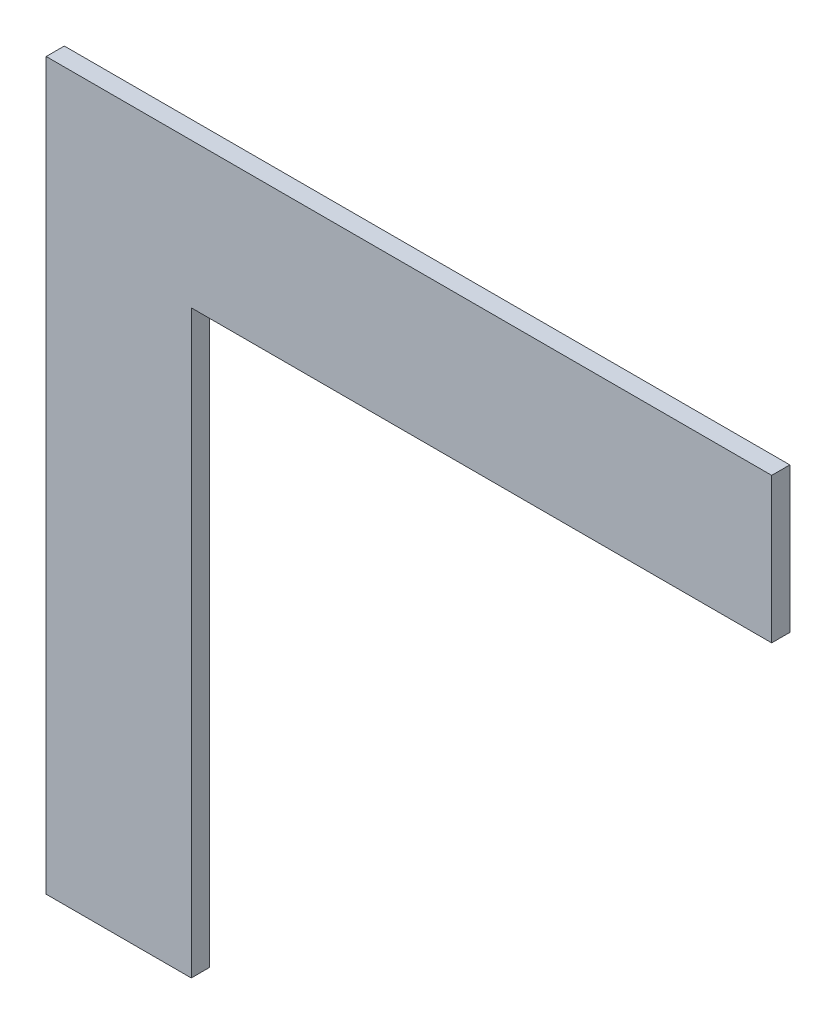
ISO-10303-21;
HEADER;
FILE_DESCRIPTION(('STEP AP214'),'2;1');
FILE_NAME('part.step','',(''),(''),'','','');
FILE_SCHEMA(('AUTOMOTIVE_DESIGN { 1 0 10303 214 1 1 1 1 }'));
ENDSEC;
DATA;
#1=APPLICATION_CONTEXT('core data for automotive mechanical design processes');
#2=APPLICATION_PROTOCOL_DEFINITION('international standard','automotive_design',2000,#1);
#3=PRODUCT_CONTEXT('',#1,'mechanical');
#4=PRODUCT('Part','Part','',(#3));
#5=PRODUCT_RELATED_PRODUCT_CATEGORY('part','',(#4));
#6=PRODUCT_DEFINITION_FORMATION('','',#4);
#7=PRODUCT_DEFINITION_CONTEXT('part definition',#1,'design');
#8=PRODUCT_DEFINITION('design','',#6,#7);
#9=PRODUCT_DEFINITION_SHAPE('','',#8);
#10=(LENGTH_UNIT() NAMED_UNIT(*) SI_UNIT(.MILLI.,.METRE.));
#11=(NAMED_UNIT(*) PLANE_ANGLE_UNIT() SI_UNIT($,.RADIAN.));
#12=(NAMED_UNIT(*) SI_UNIT($,.STERADIAN.) SOLID_ANGLE_UNIT());
#13=UNCERTAINTY_MEASURE_WITH_UNIT(LENGTH_MEASURE(1.E-05),#10,'distance_accuracy_value','');
#14=(GEOMETRIC_REPRESENTATION_CONTEXT(3) GLOBAL_UNCERTAINTY_ASSIGNED_CONTEXT((#13)) GLOBAL_UNIT_ASSIGNED_CONTEXT((#10,
#11,#12)) REPRESENTATION_CONTEXT('',''));
#15=CARTESIAN_POINT('',(0.,0.,0.));
#16=DIRECTION('',(0.,0.,1.));
#17=DIRECTION('',(1.,0.,0.));
#18=AXIS2_PLACEMENT_3D('',#15,#16,#17);
#19=CARTESIAN_POINT('',(-50.8,0.,6.35));
#20=DIRECTION('',(0.,1.,0.));
#21=DIRECTION('',(0.,0.,1.));
#22=AXIS2_PLACEMENT_3D('',#19,#20,#21);
#23=PLANE('',#22);
#24=DIRECTION('',(1.,0.,0.));
#25=VECTOR('',#24,1.);
#26=CARTESIAN_POINT('',(-50.8,0.,0.));
#27=LINE('',#26,#25);
#28=CARTESIAN_POINT('',(-50.8,0.,0.));
#29=VERTEX_POINT('',#28);
#30=CARTESIAN_POINT('',(0.,0.,0.));
#31=VERTEX_POINT('',#30);
#32=EDGE_CURVE('E119',#29,#31,#27,.T.);
#33=ORIENTED_EDGE('',*,*,#32,.T.);
#34=DIRECTION('',(0.,0.,-1.));
#35=VECTOR('',#34,1.);
#36=CARTESIAN_POINT('',(0.,0.,6.35));
#37=LINE('',#36,#35);
#38=CARTESIAN_POINT('',(0.,0.,6.35));
#39=VERTEX_POINT('',#38);
#40=EDGE_CURVE('E11',#39,#31,#37,.T.);
#41=ORIENTED_EDGE('',*,*,#40,.F.);
#42=DIRECTION('',(1.,0.,0.));
#43=VECTOR('',#42,1.);
#44=CARTESIAN_POINT('',(-50.8,0.,6.35));
#45=LINE('',#44,#43);
#46=CARTESIAN_POINT('',(-50.8,0.,6.35));
#47=VERTEX_POINT('',#46);
#48=EDGE_CURVE('E129',#47,#39,#45,.T.);
#49=ORIENTED_EDGE('',*,*,#48,.F.);
#50=DIRECTION('',(0.,0.,-1.));
#51=VECTOR('',#50,1.);
#52=CARTESIAN_POINT('',(-50.8,0.,6.35));
#53=LINE('',#52,#51);
#54=EDGE_CURVE('E115',#47,#29,#53,.T.);
#55=ORIENTED_EDGE('',*,*,#54,.T.);
#56=EDGE_LOOP('',(#33,#41,#49,#55));
#57=FACE_BOUND('',#56,.T.);
#58=ADVANCED_FACE('F35',(#57),#23,.F.);
#59=CARTESIAN_POINT('',(0.,0.,6.35));
#60=DIRECTION('',(-1.,0.,0.));
#61=DIRECTION('',(0.,0.,1.));
#62=AXIS2_PLACEMENT_3D('',#59,#60,#61);
#63=PLANE('',#62);
#64=DIRECTION('',(0.,1.,0.));
#65=VECTOR('',#64,1.);
#66=CARTESIAN_POINT('',(0.,0.,0.));
#67=LINE('',#66,#65);
#68=CARTESIAN_POINT('',(0.,203.2,0.));
#69=VERTEX_POINT('',#68);
#70=EDGE_CURVE('E122',#31,#69,#67,.T.);
#71=ORIENTED_EDGE('',*,*,#70,.T.);
#72=DIRECTION('',(0.,0.,-1.));
#73=VECTOR('',#72,1.);
#74=CARTESIAN_POINT('',(0.,203.2,6.35));
#75=LINE('',#74,#73);
#76=CARTESIAN_POINT('',(0.,203.2,6.35));
#77=VERTEX_POINT('',#76);
#78=EDGE_CURVE('E43',#77,#69,#75,.T.);
#79=ORIENTED_EDGE('',*,*,#78,.F.);
#80=DIRECTION('',(0.,1.,0.));
#81=VECTOR('',#80,1.);
#82=CARTESIAN_POINT('',(0.,0.,6.35));
#83=LINE('',#82,#81);
#84=EDGE_CURVE('E88',#39,#77,#83,.T.);
#85=ORIENTED_EDGE('',*,*,#84,.F.);
#86=ORIENTED_EDGE('',*,*,#40,.T.);
#87=EDGE_LOOP('',(#71,#79,#85,#86));
#88=FACE_BOUND('',#87,.T.);
#89=ADVANCED_FACE('F153',(#88),#63,.F.);
#90=CARTESIAN_POINT('',(0.,203.2,6.35));
#91=DIRECTION('',(0.,1.,0.));
#92=DIRECTION('',(0.,0.,1.));
#93=AXIS2_PLACEMENT_3D('',#90,#91,#92);
#94=PLANE('',#93);
#95=DIRECTION('',(1.,0.,0.));
#96=VECTOR('',#95,1.);
#97=CARTESIAN_POINT('',(0.,203.2,0.));
#98=LINE('',#97,#96);
#99=CARTESIAN_POINT('',(203.2,203.2,0.));
#100=VERTEX_POINT('',#99);
#101=EDGE_CURVE('E124',#69,#100,#98,.T.);
#102=ORIENTED_EDGE('',*,*,#101,.T.);
#103=DIRECTION('',(0.,0.,-1.));
#104=VECTOR('',#103,1.);
#105=CARTESIAN_POINT('',(203.2,203.2,6.35));
#106=LINE('',#105,#104);
#107=CARTESIAN_POINT('',(203.2,203.2,6.35));
#108=VERTEX_POINT('',#107);
#109=EDGE_CURVE('E110',#108,#100,#106,.T.);
#110=ORIENTED_EDGE('',*,*,#109,.F.);
#111=DIRECTION('',(1.,0.,0.));
#112=VECTOR('',#111,1.);
#113=CARTESIAN_POINT('',(0.,203.2,6.35));
#114=LINE('',#113,#112);
#115=EDGE_CURVE('E101',#77,#108,#114,.T.);
#116=ORIENTED_EDGE('',*,*,#115,.F.);
#117=ORIENTED_EDGE('',*,*,#78,.T.);
#118=EDGE_LOOP('',(#102,#110,#116,#117));
#119=FACE_BOUND('',#118,.T.);
#120=ADVANCED_FACE('F135',(#119),#94,.F.);
#121=CARTESIAN_POINT('',(203.2,203.2,6.35));
#122=DIRECTION('',(-1.,0.,0.));
#123=DIRECTION('',(0.,0.,1.));
#124=AXIS2_PLACEMENT_3D('',#121,#122,#123);
#125=PLANE('',#124);
#126=DIRECTION('',(0.,1.,0.));
#127=VECTOR('',#126,1.);
#128=CARTESIAN_POINT('',(203.2,203.2,0.));
#129=LINE('',#128,#127);
#130=CARTESIAN_POINT('',(203.2,254.,0.));
#131=VERTEX_POINT('',#130);
#132=EDGE_CURVE('E109',#100,#131,#129,.T.);
#133=ORIENTED_EDGE('',*,*,#132,.T.);
#134=DIRECTION('',(0.,0.,-1.));
#135=VECTOR('',#134,1.);
#136=CARTESIAN_POINT('',(203.2,254.,6.35));
#137=LINE('',#136,#135);
#138=CARTESIAN_POINT('',(203.2,254.,6.35));
#139=VERTEX_POINT('',#138);
#140=EDGE_CURVE('E106',#139,#131,#137,.T.);
#141=ORIENTED_EDGE('',*,*,#140,.F.);
#142=DIRECTION('',(0.,1.,0.));
#143=VECTOR('',#142,1.);
#144=CARTESIAN_POINT('',(203.2,203.2,6.35));
#145=LINE('',#144,#143);
#146=EDGE_CURVE('E95',#108,#139,#145,.T.);
#147=ORIENTED_EDGE('',*,*,#146,.F.);
#148=ORIENTED_EDGE('',*,*,#109,.T.);
#149=EDGE_LOOP('',(#133,#141,#147,#148));
#150=FACE_BOUND('',#149,.T.);
#151=ADVANCED_FACE('F107',(#150),#125,.F.);
#152=CARTESIAN_POINT('',(203.2,254.,6.35));
#153=DIRECTION('',(0.,-1.,0.));
#154=DIRECTION('',(1.,0.,0.));
#155=AXIS2_PLACEMENT_3D('',#152,#153,#154);
#156=PLANE('',#155);
#157=DIRECTION('',(-1.,0.,0.));
#158=VECTOR('',#157,1.);
#159=CARTESIAN_POINT('',(203.2,254.,0.));
#160=LINE('',#159,#158);
#161=CARTESIAN_POINT('',(-50.8,254.,0.));
#162=VERTEX_POINT('',#161);
#163=EDGE_CURVE('E74',#131,#162,#160,.T.);
#164=ORIENTED_EDGE('',*,*,#163,.T.);
#165=DIRECTION('',(0.,0.,-1.));
#166=VECTOR('',#165,1.);
#167=CARTESIAN_POINT('',(-50.8,254.,6.35));
#168=LINE('',#167,#166);
#169=CARTESIAN_POINT('',(-50.8,254.,6.35));
#170=VERTEX_POINT('',#169);
#171=EDGE_CURVE('E111',#170,#162,#168,.T.);
#172=ORIENTED_EDGE('',*,*,#171,.F.);
#173=DIRECTION('',(-1.,0.,0.));
#174=VECTOR('',#173,1.);
#175=CARTESIAN_POINT('',(203.2,254.,6.35));
#176=LINE('',#175,#174);
#177=EDGE_CURVE('E99',#139,#170,#176,.T.);
#178=ORIENTED_EDGE('',*,*,#177,.F.);
#179=ORIENTED_EDGE('',*,*,#140,.T.);
#180=EDGE_LOOP('',(#164,#172,#178,#179));
#181=FACE_BOUND('',#180,.T.);
#182=ADVANCED_FACE('F113',(#181),#156,.F.);
#183=CARTESIAN_POINT('',(-50.8,254.,6.35));
#184=DIRECTION('',(1.,0.,0.));
#185=DIRECTION('',(0.,1.,0.));
#186=AXIS2_PLACEMENT_3D('',#183,#184,#185);
#187=PLANE('',#186);
#188=DIRECTION('',(0.,-1.,0.));
#189=VECTOR('',#188,1.);
#190=CARTESIAN_POINT('',(-50.8,254.,0.));
#191=LINE('',#190,#189);
#192=EDGE_CURVE('E80',#162,#29,#191,.T.);
#193=ORIENTED_EDGE('',*,*,#192,.T.);
#194=ORIENTED_EDGE('',*,*,#54,.F.);
#195=DIRECTION('',(0.,-1.,0.));
#196=VECTOR('',#195,1.);
#197=CARTESIAN_POINT('',(-50.8,254.,6.35));
#198=LINE('',#197,#196);
#199=EDGE_CURVE('E51',#170,#47,#198,.T.);
#200=ORIENTED_EDGE('',*,*,#199,.F.);
#201=ORIENTED_EDGE('',*,*,#171,.T.);
#202=EDGE_LOOP('',(#193,#194,#200,#201));
#203=FACE_BOUND('',#202,.T.);
#204=ADVANCED_FACE('F142',(#203),#187,.F.);
#205=CARTESIAN_POINT('',(0.,0.,6.35));
#206=DIRECTION('',(0.,0.,1.));
#207=DIRECTION('',(1.,0.,0.));
#208=AXIS2_PLACEMENT_3D('',#205,#206,#207);
#209=PLANE('',#208);
#210=ORIENTED_EDGE('',*,*,#48,.T.);
#211=ORIENTED_EDGE('',*,*,#84,.T.);
#212=ORIENTED_EDGE('',*,*,#115,.T.);
#213=ORIENTED_EDGE('',*,*,#146,.T.);
#214=ORIENTED_EDGE('',*,*,#177,.T.);
#215=ORIENTED_EDGE('',*,*,#199,.T.);
#216=EDGE_LOOP('',(#210,#211,#212,#213,#214,#215));
#217=FACE_BOUND('',#216,.T.);
#218=ADVANCED_FACE('F97',(#217),#209,.T.);
#219=CARTESIAN_POINT('',(0.,0.,0.));
#220=DIRECTION('',(0.,0.,1.));
#221=DIRECTION('',(1.,0.,0.));
#222=AXIS2_PLACEMENT_3D('',#219,#220,#221);
#223=PLANE('',#222);
#224=ORIENTED_EDGE('',*,*,#32,.F.);
#225=ORIENTED_EDGE('',*,*,#192,.F.);
#226=ORIENTED_EDGE('',*,*,#163,.F.);
#227=ORIENTED_EDGE('',*,*,#132,.F.);
#228=ORIENTED_EDGE('',*,*,#101,.F.);
#229=ORIENTED_EDGE('',*,*,#70,.F.);
#230=EDGE_LOOP('',(#224,#225,#226,#227,#228,#229));
#231=FACE_BOUND('',#230,.T.);
#232=ADVANCED_FACE('F138',(#231),#223,.F.);
#233=CLOSED_SHELL('',(#58,#89,#120,#151,#182,#204,#218,#232));
#234=MANIFOLD_SOLID_BREP('B2',#233);
#235=ADVANCED_BREP_SHAPE_REPRESENTATION('',(#18,#234),#14);
#236=SHAPE_DEFINITION_REPRESENTATION(#9,#235);
ENDSEC;
END-ISO-10303-21;
